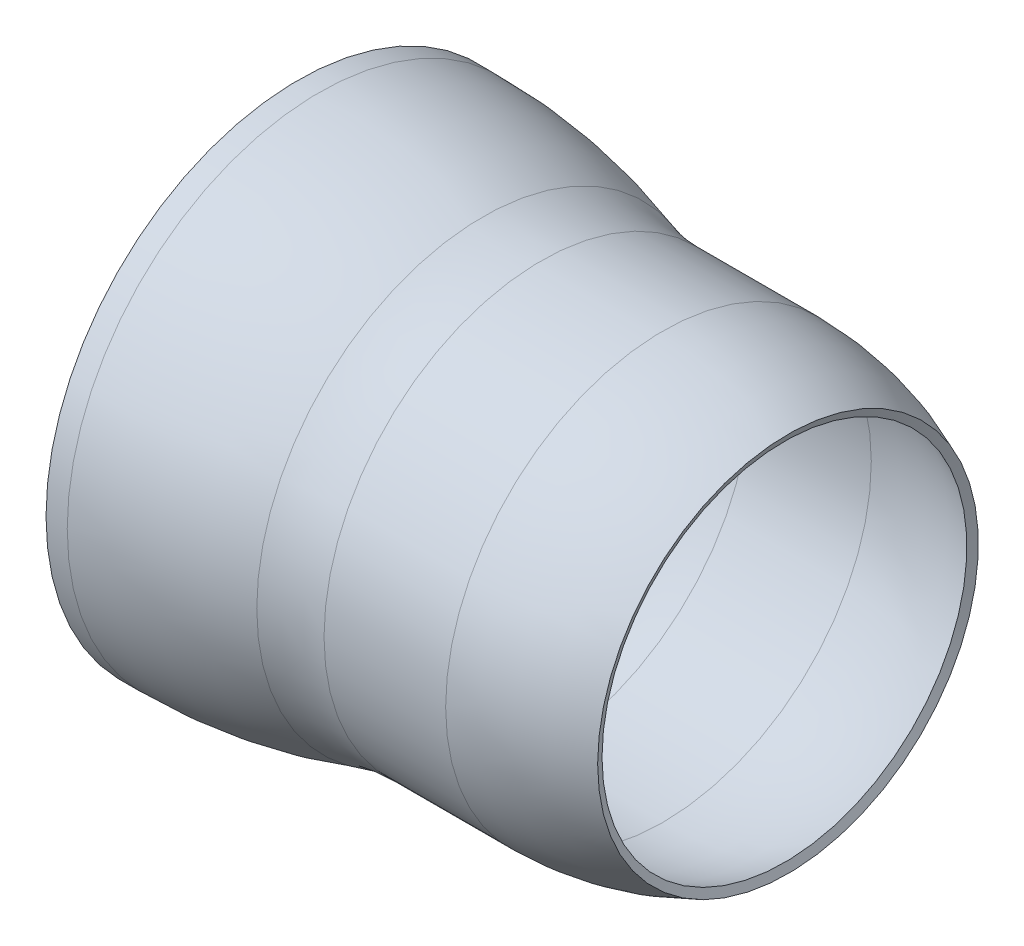
ISO-10303-21;
HEADER;
FILE_DESCRIPTION(('STEP AP214'),'2;1');
FILE_NAME('part.step','',(''),(''),'','','');
FILE_SCHEMA(('AUTOMOTIVE_DESIGN { 1 0 10303 214 1 1 1 1 }'));
ENDSEC;
DATA;
#1=APPLICATION_CONTEXT('core data for automotive mechanical design processes');
#2=APPLICATION_PROTOCOL_DEFINITION('international standard','automotive_design',2000,#1);
#3=PRODUCT_CONTEXT('',#1,'mechanical');
#4=PRODUCT('Part','Part','',(#3));
#5=PRODUCT_RELATED_PRODUCT_CATEGORY('part','',(#4));
#6=PRODUCT_DEFINITION_FORMATION('','',#4);
#7=PRODUCT_DEFINITION_CONTEXT('part definition',#1,'design');
#8=PRODUCT_DEFINITION('design','',#6,#7);
#9=PRODUCT_DEFINITION_SHAPE('','',#8);
#10=(LENGTH_UNIT() NAMED_UNIT(*) SI_UNIT(.MILLI.,.METRE.));
#11=(NAMED_UNIT(*) PLANE_ANGLE_UNIT() SI_UNIT($,.RADIAN.));
#12=(NAMED_UNIT(*) SI_UNIT($,.STERADIAN.) SOLID_ANGLE_UNIT());
#13=UNCERTAINTY_MEASURE_WITH_UNIT(LENGTH_MEASURE(1.E-05),#10,'distance_accuracy_value','');
#14=(GEOMETRIC_REPRESENTATION_CONTEXT(3) GLOBAL_UNCERTAINTY_ASSIGNED_CONTEXT((#13)) GLOBAL_UNIT_ASSIGNED_CONTEXT((#10,
#11,#12)) REPRESENTATION_CONTEXT('',''));
#15=CARTESIAN_POINT('',(0.,0.,0.));
#16=DIRECTION('',(0.,0.,1.));
#17=DIRECTION('',(1.,0.,0.));
#18=AXIS2_PLACEMENT_3D('',#15,#16,#17);
#19=CARTESIAN_POINT('',(210.,0.,0.));
#20=DIRECTION('',(-1.,0.,0.));
#21=DIRECTION('',(0.,0.,1.));
#22=AXIS2_PLACEMENT_3D('',#19,#20,#21);
#23=DEGENERATE_TOROIDAL_SURFACE('',#22,50.8333287777777,175.833329177778,.F.);
#24=CARTESIAN_POINT('',(282.048780537642,0.,0.));
#25=DIRECTION('',(-1.,0.,0.));
#26=DIRECTION('',(0.,0.,1.));
#27=AXIS2_PLACEMENT_3D('',#24,#25,#26);
#28=CIRCLE('',#27,109.560975587369);
#29=CARTESIAN_POINT('',(282.048780537642,0.,109.560975587369));
#30=VERTEX_POINT('',#29);
#31=EDGE_CURVE('E73',#30,#30,#28,.T.);
#32=ORIENTED_EDGE('',*,*,#31,.T.);
#33=EDGE_LOOP('',(#32));
#34=FACE_BOUND('',#33,.T.);
#35=CARTESIAN_POINT('',(210.,0.,0.));
#36=DIRECTION('',(-1.,0.,0.));
#37=DIRECTION('',(0.,0.,1.));
#38=AXIS2_PLACEMENT_3D('',#35,#36,#37);
#39=CIRCLE('',#38,125.0000004);
#40=CARTESIAN_POINT('',(210.,0.,125.0000004));
#41=VERTEX_POINT('',#40);
#42=EDGE_CURVE('E10',#41,#41,#39,.T.);
#43=ORIENTED_EDGE('',*,*,#42,.F.);
#44=EDGE_LOOP('',(#43));
#45=FACE_BOUND('',#44,.T.);
#46=ADVANCED_FACE('F33',(#34,#45),#23,.F.);
#47=CARTESIAN_POINT('',(0.,0.,0.));
#48=DIRECTION('',(-1.,0.,0.));
#49=DIRECTION('',(0.,0.,1.));
#50=AXIS2_PLACEMENT_3D('',#47,#48,#49);
#51=CYLINDRICAL_SURFACE('',#50,125.0000004);
#52=ORIENTED_EDGE('',*,*,#42,.T.);
#53=EDGE_LOOP('',(#52));
#54=FACE_BOUND('',#53,.T.);
#55=CARTESIAN_POINT('',(140.,0.,0.));
#56=DIRECTION('',(-1.,0.,0.));
#57=DIRECTION('',(0.,0.,1.));
#58=AXIS2_PLACEMENT_3D('',#55,#56,#57);
#59=CIRCLE('',#58,125.0000004);
#60=CARTESIAN_POINT('',(140.,0.,125.0000004));
#61=VERTEX_POINT('',#60);
#62=EDGE_CURVE('E39',#61,#61,#59,.T.);
#63=ORIENTED_EDGE('',*,*,#62,.F.);
#64=EDGE_LOOP('',(#63));
#65=FACE_BOUND('',#64,.T.);
#66=ADVANCED_FACE('F109',(#54,#65),#51,.T.);
#67=CARTESIAN_POINT('',(140.,0.,0.));
#68=DIRECTION('',(-1.,0.,0.));
#69=DIRECTION('',(0.,0.,1.));
#70=AXIS2_PLACEMENT_3D('',#67,#68,#69);
#71=TOROIDAL_SURFACE('',#70,234.555979518456,109.555979118456);
#72=CARTESIAN_POINT('',(106.52763741663,0.,0.));
#73=DIRECTION('',(-1.,0.,0.));
#74=DIRECTION('',(0.,0.,1.));
#75=AXIS2_PLACEMENT_3D('',#72,#73,#74);
#76=CIRCLE('',#75,130.238610381332);
#77=CARTESIAN_POINT('',(106.52763741663,0.,130.238610381332));
#78=VERTEX_POINT('',#77);
#79=EDGE_CURVE('E43',#78,#78,#76,.T.);
#80=ORIENTED_EDGE('',*,*,#79,.F.);
#81=EDGE_LOOP('',(#80));
#82=FACE_BOUND('',#81,.T.);
#83=ORIENTED_EDGE('',*,*,#62,.T.);
#84=EDGE_LOOP('',(#83));
#85=FACE_BOUND('',#84,.T.);
#86=ADVANCED_FACE('F113',(#82,#85),#71,.F.);
#87=CARTESIAN_POINT('',(12.2089942438845,0.,0.));
#88=DIRECTION('',(-1.,0.,0.));
#89=DIRECTION('',(0.,0.,1.));
#90=AXIS2_PLACEMENT_3D('',#87,#88,#89);
#91=DEGENERATE_TOROIDAL_SURFACE('',#90,163.707557650803,308.707557650803,.F.);
#92=ORIENTED_EDGE('',*,*,#79,.T.);
#93=EDGE_LOOP('',(#92));
#94=FACE_BOUND('',#93,.T.);
#95=CARTESIAN_POINT('',(12.2089942438845,0.,0.));
#96=DIRECTION('',(-1.,0.,0.));
#97=DIRECTION('',(0.,0.,1.));
#98=AXIS2_PLACEMENT_3D('',#95,#96,#97);
#99=CIRCLE('',#98,145.);
#100=CARTESIAN_POINT('',(12.2089942438845,0.,145.));
#101=VERTEX_POINT('',#100);
#102=EDGE_CURVE('E47',#101,#101,#99,.T.);
#103=ORIENTED_EDGE('',*,*,#102,.F.);
#104=EDGE_LOOP('',(#103));
#105=FACE_BOUND('',#104,.T.);
#106=ADVANCED_FACE('F117',(#94,#105),#91,.F.);
#107=CARTESIAN_POINT('',(0.,0.,0.));
#108=DIRECTION('',(-1.,0.,0.));
#109=DIRECTION('',(0.,0.,1.));
#110=AXIS2_PLACEMENT_3D('',#107,#108,#109);
#111=CYLINDRICAL_SURFACE('',#110,145.);
#112=ORIENTED_EDGE('',*,*,#102,.T.);
#113=EDGE_LOOP('',(#112));
#114=FACE_BOUND('',#113,.T.);
#115=CARTESIAN_POINT('',(0.,0.,0.));
#116=DIRECTION('',(-1.,0.,0.));
#117=DIRECTION('',(0.,0.,1.));
#118=AXIS2_PLACEMENT_3D('',#115,#116,#117);
#119=CIRCLE('',#118,145.);
#120=CARTESIAN_POINT('',(0.,0.,145.));
#121=VERTEX_POINT('',#120);
#122=EDGE_CURVE('E52',#121,#121,#119,.T.);
#123=ORIENTED_EDGE('',*,*,#122,.F.);
#124=EDGE_LOOP('',(#123));
#125=FACE_BOUND('',#124,.T.);
#126=ADVANCED_FACE('F124',(#114,#125),#111,.T.);
#127=CARTESIAN_POINT('',(0.,0.,0.));
#128=DIRECTION('',(1.,0.,0.));
#129=DIRECTION('',(0.,0.,-1.));
#130=AXIS2_PLACEMENT_3D('',#127,#128,#129);
#131=PLANE('',#130);
#132=CARTESIAN_POINT('',(0.,0.,0.));
#133=DIRECTION('',(-1.,0.,0.));
#134=DIRECTION('',(0.,0.,1.));
#135=AXIS2_PLACEMENT_3D('',#132,#133,#134);
#136=CIRCLE('',#135,140.);
#137=CARTESIAN_POINT('',(0.,0.,140.));
#138=VERTEX_POINT('',#137);
#139=EDGE_CURVE('E55',#138,#138,#136,.T.);
#140=ORIENTED_EDGE('',*,*,#139,.F.);
#141=EDGE_LOOP('',(#140));
#142=FACE_BOUND('',#141,.T.);
#143=ORIENTED_EDGE('',*,*,#122,.T.);
#144=EDGE_LOOP('',(#143));
#145=FACE_BOUND('',#144,.T.);
#146=ADVANCED_FACE('F128',(#142,#145),#131,.F.);
#147=CARTESIAN_POINT('',(0.,0.,0.));
#148=DIRECTION('',(-1.,0.,0.));
#149=DIRECTION('',(0.,0.,1.));
#150=AXIS2_PLACEMENT_3D('',#147,#148,#149);
#151=CYLINDRICAL_SURFACE('',#150,140.);
#152=CARTESIAN_POINT('',(12.2089942438845,0.,0.));
#153=DIRECTION('',(-1.,0.,0.));
#154=DIRECTION('',(0.,0.,1.));
#155=AXIS2_PLACEMENT_3D('',#152,#153,#154);
#156=CIRCLE('',#155,140.);
#157=CARTESIAN_POINT('',(12.2089942438845,0.,140.));
#158=VERTEX_POINT('',#157);
#159=EDGE_CURVE('E58',#158,#158,#156,.T.);
#160=ORIENTED_EDGE('',*,*,#159,.F.);
#161=EDGE_LOOP('',(#160));
#162=FACE_BOUND('',#161,.T.);
#163=ORIENTED_EDGE('',*,*,#139,.T.);
#164=EDGE_LOOP('',(#163));
#165=FACE_BOUND('',#164,.T.);
#166=ADVANCED_FACE('F105',(#162,#165),#151,.F.);
#167=CARTESIAN_POINT('',(12.2089942438845,0.,0.));
#168=DIRECTION('',(-1.,0.,0.));
#169=DIRECTION('',(0.,0.,1.));
#170=AXIS2_PLACEMENT_3D('',#167,#168,#169);
#171=DEGENERATE_TOROIDAL_SURFACE('',#170,163.707557650803,303.707557650803,.F.);
#172=CARTESIAN_POINT('',(105.,0.,0.));
#173=DIRECTION('',(-1.,0.,0.));
#174=DIRECTION('',(0.,0.,1.));
#175=AXIS2_PLACEMENT_3D('',#172,#173,#174);
#176=CIRCLE('',#175,125.477694091025);
#177=CARTESIAN_POINT('',(105.,0.,125.477694091025));
#178=VERTEX_POINT('',#177);
#179=EDGE_CURVE('E61',#178,#178,#176,.T.);
#180=ORIENTED_EDGE('',*,*,#179,.F.);
#181=EDGE_LOOP('',(#180));
#182=FACE_BOUND('',#181,.T.);
#183=ORIENTED_EDGE('',*,*,#159,.T.);
#184=EDGE_LOOP('',(#183));
#185=FACE_BOUND('',#184,.T.);
#186=ADVANCED_FACE('F99',(#182,#185),#171,.T.);
#187=CARTESIAN_POINT('',(140.,0.,0.));
#188=DIRECTION('',(-1.,0.,0.));
#189=DIRECTION('',(0.,0.,1.));
#190=AXIS2_PLACEMENT_3D('',#187,#188,#189);
#191=TOROIDAL_SURFACE('',#190,234.555979518456,114.555979118456);
#192=ORIENTED_EDGE('',*,*,#179,.T.);
#193=EDGE_LOOP('',(#192));
#194=FACE_BOUND('',#193,.T.);
#195=CARTESIAN_POINT('',(140.,0.,0.));
#196=DIRECTION('',(-1.,0.,0.));
#197=DIRECTION('',(0.,0.,1.));
#198=AXIS2_PLACEMENT_3D('',#195,#196,#197);
#199=CIRCLE('',#198,120.0000004);
#200=CARTESIAN_POINT('',(140.,0.,120.0000004));
#201=VERTEX_POINT('',#200);
#202=EDGE_CURVE('E64',#201,#201,#199,.T.);
#203=ORIENTED_EDGE('',*,*,#202,.F.);
#204=EDGE_LOOP('',(#203));
#205=FACE_BOUND('',#204,.T.);
#206=ADVANCED_FACE('F94',(#194,#205),#191,.T.);
#207=CARTESIAN_POINT('',(0.,0.,0.));
#208=DIRECTION('',(-1.,0.,0.));
#209=DIRECTION('',(0.,0.,1.));
#210=AXIS2_PLACEMENT_3D('',#207,#208,#209);
#211=CYLINDRICAL_SURFACE('',#210,120.0000004);
#212=CARTESIAN_POINT('',(210.,0.,0.));
#213=DIRECTION('',(-1.,0.,0.));
#214=DIRECTION('',(0.,0.,1.));
#215=AXIS2_PLACEMENT_3D('',#212,#213,#214);
#216=CIRCLE('',#215,120.0000004);
#217=CARTESIAN_POINT('',(210.,0.,120.0000004));
#218=VERTEX_POINT('',#217);
#219=EDGE_CURVE('E67',#218,#218,#216,.T.);
#220=ORIENTED_EDGE('',*,*,#219,.F.);
#221=EDGE_LOOP('',(#220));
#222=FACE_BOUND('',#221,.T.);
#223=ORIENTED_EDGE('',*,*,#202,.T.);
#224=EDGE_LOOP('',(#223));
#225=FACE_BOUND('',#224,.T.);
#226=ADVANCED_FACE('F88',(#222,#225),#211,.F.);
#227=CARTESIAN_POINT('',(210.,0.,0.));
#228=DIRECTION('',(-1.,0.,0.));
#229=DIRECTION('',(0.,0.,1.));
#230=AXIS2_PLACEMENT_3D('',#227,#228,#229);
#231=DEGENERATE_TOROIDAL_SURFACE('',#230,50.8333287777777,170.833329177778,.F.);
#232=CARTESIAN_POINT('',(280.,0.,0.));
#233=DIRECTION('',(-1.,0.,0.));
#234=DIRECTION('',(0.,0.,1.));
#235=AXIS2_PLACEMENT_3D('',#232,#233,#234);
#236=CIRCLE('',#235,105.);
#237=CARTESIAN_POINT('',(280.,0.,105.));
#238=VERTEX_POINT('',#237);
#239=EDGE_CURVE('E70',#238,#238,#236,.T.);
#240=ORIENTED_EDGE('',*,*,#239,.F.);
#241=EDGE_LOOP('',(#240));
#242=FACE_BOUND('',#241,.T.);
#243=ORIENTED_EDGE('',*,*,#219,.T.);
#244=EDGE_LOOP('',(#243));
#245=FACE_BOUND('',#244,.T.);
#246=ADVANCED_FACE('F82',(#242,#245),#231,.T.);
#247=CARTESIAN_POINT('',(280.,0.,0.));
#248=DIRECTION('',(1.,0.,0.));
#249=DIRECTION('',(0.,0.,-1.));
#250=AXIS2_PLACEMENT_3D('',#247,#248,#249);
#251=CONICAL_SURFACE('',#250,105.,1.14860964942257);
#252=ORIENTED_EDGE('',*,*,#31,.F.);
#253=EDGE_LOOP('',(#252));
#254=FACE_BOUND('',#253,.T.);
#255=ORIENTED_EDGE('',*,*,#239,.T.);
#256=EDGE_LOOP('',(#255));
#257=FACE_BOUND('',#256,.T.);
#258=ADVANCED_FACE('F79',(#254,#257),#251,.F.);
#259=CLOSED_SHELL('',(#46,#66,#86,#106,#126,#146,#166,#186,#206,#226,#246,#258));
#260=MANIFOLD_SOLID_BREP('B2',#259);
#261=ADVANCED_BREP_SHAPE_REPRESENTATION('',(#18,#260),#14);
#262=SHAPE_DEFINITION_REPRESENTATION(#9,#261);
ENDSEC;
END-ISO-10303-21;
